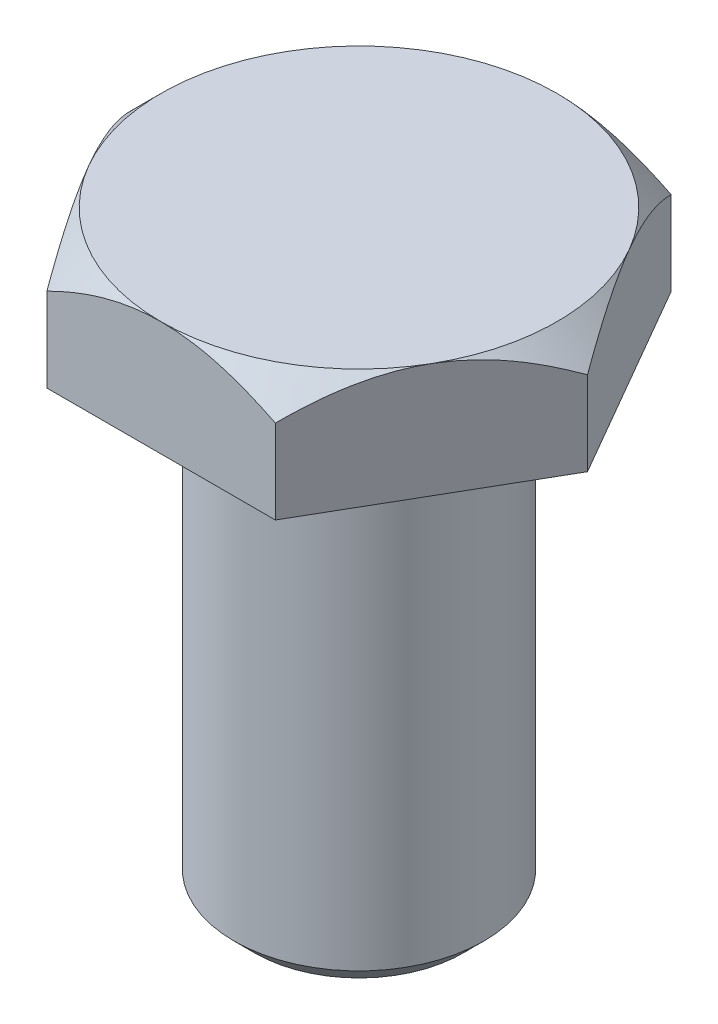
ISO-10303-21;
HEADER;
FILE_DESCRIPTION(('STEP AP214'),'2;1');
FILE_NAME('part.step','',(''),(''),'','','');
FILE_SCHEMA(('AUTOMOTIVE_DESIGN { 1 0 10303 214 1 1 1 1 }'));
ENDSEC;
DATA;
#1=APPLICATION_CONTEXT('core data for automotive mechanical design processes');
#2=APPLICATION_PROTOCOL_DEFINITION('international standard','automotive_design',2000,#1);
#3=PRODUCT_CONTEXT('',#1,'mechanical');
#4=PRODUCT('Part','Part','',(#3));
#5=PRODUCT_RELATED_PRODUCT_CATEGORY('part','',(#4));
#6=PRODUCT_DEFINITION_FORMATION('','',#4);
#7=PRODUCT_DEFINITION_CONTEXT('part definition',#1,'design');
#8=PRODUCT_DEFINITION('design','',#6,#7);
#9=PRODUCT_DEFINITION_SHAPE('','',#8);
#10=(LENGTH_UNIT() NAMED_UNIT(*) SI_UNIT(.MILLI.,.METRE.));
#11=(NAMED_UNIT(*) PLANE_ANGLE_UNIT() SI_UNIT($,.RADIAN.));
#12=(NAMED_UNIT(*) SI_UNIT($,.STERADIAN.) SOLID_ANGLE_UNIT());
#13=UNCERTAINTY_MEASURE_WITH_UNIT(LENGTH_MEASURE(1.E-05),#10,'distance_accuracy_value','');
#14=(GEOMETRIC_REPRESENTATION_CONTEXT(3) GLOBAL_UNCERTAINTY_ASSIGNED_CONTEXT((#13)) GLOBAL_UNIT_ASSIGNED_CONTEXT((#10,
#11,#12)) REPRESENTATION_CONTEXT('',''));
#15=CARTESIAN_POINT('',(0.,0.,0.));
#16=DIRECTION('',(0.,0.,1.));
#17=DIRECTION('',(1.,0.,0.));
#18=AXIS2_PLACEMENT_3D('',#15,#16,#17);
#19=CARTESIAN_POINT('',(5.48482755730145,5.5,9.5));
#20=DIRECTION('',(-0.866025403784439,0.,-0.5));
#21=DIRECTION('',(-0.5,0.,0.866025403784439));
#22=AXIS2_PLACEMENT_3D('',#19,#20,#21);
#23=PLANE('',#22);
#24=CARTESIAN_POINT('',(5.48471208724761,4.03022941352008,9.5002));
#25=CARTESIAN_POINT('',(5.57900903100241,4.12451305275812,9.33687290241823));
#26=CARTESIAN_POINT('',(5.67404447275101,4.21591967907672,9.17226668878989));
#27=CARTESIAN_POINT('',(5.86570730642932,4.39206501429793,8.84029692293643));
#28=CARTESIAN_POINT('',(5.96233553343551,4.47680008162165,8.67293192431642));
#29=CARTESIAN_POINT('',(6.15775465782218,4.63904726595057,8.33445607210808));
#30=CARTESIAN_POINT('',(6.25655477026744,4.71651524790198,8.16332925755938));
#31=CARTESIAN_POINT('',(6.45577775543312,4.86254572212603,7.81826492521687));
#32=CARTESIAN_POINT('',(6.55620037740737,4.93110957593673,7.6443278417282));
#33=CARTESIAN_POINT('',(6.75705373920339,5.05716241426521,7.29643961422646));
#34=CARTESIAN_POINT('',(6.8574597962813,5.11480781409619,7.12253122197986));
#35=CARTESIAN_POINT('',(7.05967942874735,5.21916953089301,6.77227654426076));
#36=CARTESIAN_POINT('',(7.16149285135171,5.26588702447714,6.59593052341753));
#37=CARTESIAN_POINT('',(7.36609172761754,5.3472167639281,6.24155487455362));
#38=CARTESIAN_POINT('',(7.46887444897753,5.38185625756676,6.06352997901792));
#39=CARTESIAN_POINT('',(7.67530278601613,5.43826883773012,5.70598561114512));
#40=CARTESIAN_POINT('',(7.77894827040215,5.46004384690283,5.52646636621343));
#41=CARTESIAN_POINT('',(8.03152319659844,5.49655435673329,5.08899376132351));
#42=CARTESIAN_POINT('',(8.18072563612125,5.50421609749858,4.83056755545678));
#43=CARTESIAN_POINT('',(8.47886067593323,5.49135626172781,4.31418251898585));
#44=CARTESIAN_POINT('',(8.62779316331623,5.47082480615118,4.05622388394088));
#45=CARTESIAN_POINT('',(8.92425422695666,5.40279045892086,3.54273825924976));
#46=CARTESIAN_POINT('',(9.07178104546182,5.35525740747113,3.28721431411982));
#47=CARTESIAN_POINT('',(9.36429897995981,5.2358036134359,2.78055838944421));
#48=CARTESIAN_POINT('',(9.50929028950328,5.1638847409879,2.52942607465897));
#49=CARTESIAN_POINT('',(9.76666961157864,5.01592936852339,2.0836320120068));
#50=CARTESIAN_POINT('',(9.87962765862301,4.94378482539215,1.88798293540221));
#51=CARTESIAN_POINT('',(10.1035161311739,4.78787046820498,1.5001967257151));
#52=CARTESIAN_POINT('',(10.2144464952021,4.70410030232546,1.30805969911616));
#53=CARTESIAN_POINT('',(10.4339302023285,4.52681237218113,0.927902766939698));
#54=CARTESIAN_POINT('',(10.5424897875299,4.43332526303183,0.739872049722142));
#55=CARTESIAN_POINT('',(10.7575988522843,4.23783068526742,0.367292220399022));
#56=CARTESIAN_POINT('',(10.8641495158537,4.13582844079842,0.182741057516513));
#57=CARTESIAN_POINT('',(10.9697705846567,4.03022941352008,-0.000200000000001017));
#58=B_SPLINE_CURVE_WITH_KNOTS('',3,(#24,#25,#26,#27,#28,#29,#30,#31,#32,#33,#34,#35,#36,#37,#38,
#39,#40,#41,#42,#43,#44,#45,#46,#47,#48,#49,#50,#51,#52,#53,#54,#55,#56,#57),.UNSPECIFIED.,.F.,
.F.,(4,2,2,2,2,2,2,2,2,2,2,2,2,2,2,2,4),(0.,0.63257206267041,1.26548704629925,1.9020259640234,
2.53846743312796,3.16495668699838,3.79137845508004,4.41637774062803,5.04128359391858,
5.93539756360894,6.82982491537984,7.72525327976969,8.62061298969156,9.33174689146321,
10.0429023188133,10.7518786251228,11.4604231176808),.UNSPECIFIED.);
#59=CARTESIAN_POINT('',(5.48482755730146,4.03034488539711,9.5));
#60=VERTEX_POINT('',#59);
#61=CARTESIAN_POINT('',(8.22724133595217,5.5,4.75));
#62=VERTEX_POINT('',#61);
#63=EDGE_CURVE('E123',#60,#62,#58,.T.);
#64=ORIENTED_EDGE('',*,*,#63,.F.);
#65=DIRECTION('',(0.,-1.,0.));
#66=VECTOR('',#65,1.);
#67=CARTESIAN_POINT('',(5.48482755730145,5.5,9.5));
#68=LINE('',#67,#66);
#69=CARTESIAN_POINT('',(5.48482755730145,0.,9.5));
#70=VERTEX_POINT('',#69);
#71=EDGE_CURVE('E69',#60,#70,#68,.T.);
#72=ORIENTED_EDGE('',*,*,#71,.T.);
#73=DIRECTION('',(0.5,0.,-0.866025403784439));
#74=VECTOR('',#73,1.);
#75=CARTESIAN_POINT('',(5.48482755730145,0.,9.5));
#76=LINE('',#75,#74);
#77=CARTESIAN_POINT('',(10.9696551146029,0.,0.));
#78=VERTEX_POINT('',#77);
#79=EDGE_CURVE('E133',#70,#78,#76,.T.);
#80=ORIENTED_EDGE('',*,*,#79,.T.);
#81=DIRECTION('',(0.,-1.,0.));
#82=VECTOR('',#81,1.);
#83=CARTESIAN_POINT('',(10.9696551146029,5.5,0.));
#84=LINE('',#83,#82);
#85=CARTESIAN_POINT('',(10.9696551146029,4.03034488539711,0.));
#86=VERTEX_POINT('',#85);
#87=EDGE_CURVE('E152',#86,#78,#84,.T.);
#88=ORIENTED_EDGE('',*,*,#87,.F.);
#89=EDGE_CURVE('E132',#62,#86,#58,.T.);
#90=ORIENTED_EDGE('',*,*,#89,.F.);
#91=EDGE_LOOP('',(#64,#72,#80,#88,#90));
#92=FACE_BOUND('',#91,.T.);
#93=ADVANCED_FACE('F45',(#92),#23,.F.);
#94=CARTESIAN_POINT('',(10.9696551146029,5.5,0.));
#95=DIRECTION('',(-0.866025403784438,0.,0.500000000000001));
#96=DIRECTION('',(0.500000000000001,0.,0.866025403784438));
#97=AXIS2_PLACEMENT_3D('',#94,#95,#96);
#98=PLANE('',#97);
#99=CARTESIAN_POINT('',(10.9697705846567,4.03022941352008,0.000200000000000085));
#100=CARTESIAN_POINT('',(10.8754736409019,4.12451305275812,-0.163127097581767));
#101=CARTESIAN_POINT('',(10.7804381991533,4.21591967907672,-0.327733311210104));
#102=CARTESIAN_POINT('',(10.588775365475,4.39206501429793,-0.659703077063567));
#103=CARTESIAN_POINT('',(10.4921471384688,4.47680008162164,-0.827068075683574));
#104=CARTESIAN_POINT('',(10.2967280140822,4.63904726595057,-1.16554392789191));
#105=CARTESIAN_POINT('',(10.1979279016369,4.71651524790198,-1.33667074244062));
#106=CARTESIAN_POINT('',(9.99870491647122,4.86254572212603,-1.68173507478313));
#107=CARTESIAN_POINT('',(9.89828229449697,4.93110957593673,-1.85567215827181));
#108=CARTESIAN_POINT('',(9.69742893270094,5.05716241426521,-2.20356038577354));
#109=CARTESIAN_POINT('',(9.59702287562303,5.11480781409619,-2.37746877802014));
#110=CARTESIAN_POINT('',(9.39480324315698,5.21916953089301,-2.72772345573924));
#111=CARTESIAN_POINT('',(9.29298982055263,5.26588702447714,-2.90406947658247));
#112=CARTESIAN_POINT('',(9.0883909442868,5.3472167639281,-3.25844512544638));
#113=CARTESIAN_POINT('',(8.98560822292681,5.38185625756677,-3.43647002098208));
#114=CARTESIAN_POINT('',(8.77917988588821,5.43826883773012,-3.79401438885488));
#115=CARTESIAN_POINT('',(8.67553440150218,5.46004384690283,-3.97353363378657));
#116=CARTESIAN_POINT('',(8.4229594753059,5.4965543567333,-4.4110062386765));
#117=CARTESIAN_POINT('',(8.27375703578308,5.50421609749859,-4.66943244454323));
#118=CARTESIAN_POINT('',(7.9756219959711,5.49135626172781,-5.18581748101415));
#119=CARTESIAN_POINT('',(7.8266895085881,5.47082480615119,-5.44377611605912));
#120=CARTESIAN_POINT('',(7.53022844494767,5.40279045892086,-5.95726174075025));
#121=CARTESIAN_POINT('',(7.38270162644251,5.35525740747113,-6.21278568588018));
#122=CARTESIAN_POINT('',(7.09018369194453,5.2358036134359,-6.7194416105558));
#123=CARTESIAN_POINT('',(6.94519238240105,5.1638847409879,-6.97057392534104));
#124=CARTESIAN_POINT('',(6.68781306032569,5.01592936852339,-7.4163679879932));
#125=CARTESIAN_POINT('',(6.57485501328133,4.94378482539215,-7.61201706459779));
#126=CARTESIAN_POINT('',(6.35096654073045,4.78787046820498,-7.99980327428491));
#127=CARTESIAN_POINT('',(6.24003617670226,4.70410030232547,-8.19194030088384));
#128=CARTESIAN_POINT('',(6.02055246957587,4.52681237218114,-8.5720972330603));
#129=CARTESIAN_POINT('',(5.9119928843744,4.43332526303183,-8.76012795027786));
#130=CARTESIAN_POINT('',(5.69688381962007,4.23783068526743,-9.13270777960098));
#131=CARTESIAN_POINT('',(5.5903331560506,4.13582844079842,-9.31725894248349));
#132=CARTESIAN_POINT('',(5.4847120872476,4.03022941352008,-9.5002));
#133=B_SPLINE_CURVE_WITH_KNOTS('',3,(#99,#100,#101,#102,#103,#104,#105,#106,#107,#108,#109,#110,
#111,#112,#113,#114,#115,#116,#117,#118,#119,#120,#121,#122,#123,#124,#125,#126,#127,#128,#129,
#130,#131,#132),.UNSPECIFIED.,.F.,.F.,(4,2,2,2,2,2,2,2,2,2,2,2,2,2,2,2,4),(0.,0.632572062670412,
1.26548704629925,1.90202596402341,2.53846743312797,3.16495668699839,3.79137845508005,
4.41637774062804,5.0412835939186,5.93539756360895,6.82982491537985,7.72525327976971,
8.62061298969157,9.33174689146323,10.0429023188133,10.7518786251229,11.4604231176808),.UNSPECIFIED.);
#134=CARTESIAN_POINT('',(8.22724133595217,5.5,-4.75000000000001));
#135=VERTEX_POINT('',#134);
#136=EDGE_CURVE('E231',#86,#135,#133,.T.);
#137=ORIENTED_EDGE('',*,*,#136,.F.);
#138=ORIENTED_EDGE('',*,*,#87,.T.);
#139=DIRECTION('',(-0.5,0.,-0.866025403784438));
#140=VECTOR('',#139,1.);
#141=CARTESIAN_POINT('',(10.9696551146029,0.,0.));
#142=LINE('',#141,#140);
#143=CARTESIAN_POINT('',(5.48482755730144,0.,-9.5));
#144=VERTEX_POINT('',#143);
#145=EDGE_CURVE('E266',#78,#144,#142,.T.);
#146=ORIENTED_EDGE('',*,*,#145,.T.);
#147=DIRECTION('',(0.,-1.,0.));
#148=VECTOR('',#147,1.);
#149=CARTESIAN_POINT('',(5.48482755730144,5.5,-9.5));
#150=LINE('',#149,#148);
#151=CARTESIAN_POINT('',(5.48482755730145,4.03034488539711,-9.5));
#152=VERTEX_POINT('',#151);
#153=EDGE_CURVE('E150',#152,#144,#150,.T.);
#154=ORIENTED_EDGE('',*,*,#153,.F.);
#155=EDGE_CURVE('E225',#135,#152,#133,.T.);
#156=ORIENTED_EDGE('',*,*,#155,.F.);
#157=EDGE_LOOP('',(#137,#138,#146,#154,#156));
#158=FACE_BOUND('',#157,.T.);
#159=ADVANCED_FACE('F239',(#158),#98,.F.);
#160=CARTESIAN_POINT('',(5.48482755730144,5.5,-9.5));
#161=DIRECTION('',(0.,0.,1.));
#162=DIRECTION('',(1.,0.,0.));
#163=AXIS2_PLACEMENT_3D('',#160,#161,#162);
#164=PLANE('',#163);
#165=CARTESIAN_POINT('',(16.5526930513978,-4.08511585644147,-9.5));
#166=CARTESIAN_POINT('',(16.3078975093556,-3.87281064033944,-9.5));
#167=CARTESIAN_POINT('',(16.0625313530003,-3.66116146645664,-9.5));
#168=CARTESIAN_POINT('',(15.5705039782896,-3.23936595886109,-9.5));
#169=CARTESIAN_POINT('',(15.3238427385609,-3.02921965008696,-9.5));
#170=CARTESIAN_POINT('',(14.8289626137527,-2.61052881441162,-9.5));
#171=CARTESIAN_POINT('',(14.5807430479804,-2.40198509096151,-9.5));
#172=CARTESIAN_POINT('',(14.0826815219023,-1.98684897000587,-9.5));
#173=CARTESIAN_POINT('',(13.8328395672994,-1.78025656564741,-9.5));
#174=CARTESIAN_POINT('',(13.0690339736071,-1.15434157818636,-9.5));
#175=CARTESIAN_POINT('',(12.5521592758855,-0.738542800162536,-9.5));
#176=CARTESIAN_POINT('',(11.7695040497769,-0.124327504116688,-9.5));
#177=CARTESIAN_POINT('',(11.507423703153,0.0788091039046497,-9.5));
#178=CARTESIAN_POINT('',(10.9804259452721,0.481364439199906,-9.5));
#179=CARTESIAN_POINT('',(10.7155085937285,0.680783244485111,-9.5));
#180=CARTESIAN_POINT('',(10.182049087553,1.07549325818297,-9.5));
#181=CARTESIAN_POINT('',(9.91350246392285,1.27077843710951,-9.5));
#182=CARTESIAN_POINT('',(9.37263900317949,1.65607522397668,-9.5));
#183=CARTESIAN_POINT('',(9.10032212381803,1.84608677275087,-9.5));
#184=CARTESIAN_POINT('',(8.5511040508471,2.21990378369879,-9.5));
#185=CARTESIAN_POINT('',(8.27419909438331,2.40370373356655,-9.5));
#186=CARTESIAN_POINT('',(7.71537207132478,2.7635278733879,-9.5));
#187=CARTESIAN_POINT('',(7.43345011396875,2.939552232355,-9.5));
#188=CARTESIAN_POINT('',(6.86601677310837,3.28073476767734,-9.5));
#189=CARTESIAN_POINT('',(6.58054944164094,3.44596586624554,-9.5));
#190=CARTESIAN_POINT('',(6.00311604351526,3.76481218488239,-9.5));
#191=CARTESIAN_POINT('',(5.71114919950853,3.91842600574613,-9.5));
#192=CARTESIAN_POINT('',(5.12043515567325,4.21097227681983,-9.5));
#193=CARTESIAN_POINT('',(4.8216986951507,4.34992623962902,-9.5));
#194=CARTESIAN_POINT('',(4.21657051360468,4.60986676858188,-9.5));
#195=CARTESIAN_POINT('',(3.91018182234153,4.73086031809269,-9.5));
#196=CARTESIAN_POINT('',(3.28232408499689,4.95333057796222,-9.5));
#197=CARTESIAN_POINT('',(2.96067021723213,5.05429302050932,-9.5));
#198=CARTESIAN_POINT('',(2.30981414137871,5.22825264789689,-9.5));
#199=CARTESIAN_POINT('',(1.98061314702205,5.30125429642786,-9.5));
#200=CARTESIAN_POINT('',(1.31859709228853,5.41443128902268,-9.5));
#201=CARTESIAN_POINT('',(0.985816892761966,5.45480651597028,-9.5));
#202=CARTESIAN_POINT('',(0.317839349931747,5.50052179933779,-9.5));
#203=CARTESIAN_POINT('',(-0.0173577358812772,5.50586553431007,-9.5));
#204=CARTESIAN_POINT('',(-0.686846353851571,5.4810888627539,-9.5));
#205=CARTESIAN_POINT('',(-1.02113613756876,5.45092224928178,-9.5));
#206=CARTESIAN_POINT('',(-1.68499248709887,5.3573312936306,-9.5));
#207=CARTESIAN_POINT('',(-2.01455810978228,5.29390040302652,-9.5));
#208=CARTESIAN_POINT('',(-2.66891687175004,5.13737631327669,-9.5));
#209=CARTESIAN_POINT('',(-2.99365954142614,5.04407579579886,-9.5));
#210=CARTESIAN_POINT('',(-3.63491027073979,4.83285441566069,-9.5));
#211=CARTESIAN_POINT('',(-3.95141823945259,4.71493328127758,-9.5));
#212=CARTESIAN_POINT('',(-4.6466341624565,4.43027536615136,-9.5));
#213=CARTESIAN_POINT('',(-5.02327276275549,4.2585270273701,-9.5));
#214=CARTESIAN_POINT('',(-5.7653347821525,3.89212395071921,-9.5));
#215=CARTESIAN_POINT('',(-6.1307515640984,3.69745597391214,-9.5));
#216=CARTESIAN_POINT('',(-6.8524378145585,3.29030367022418,-9.5));
#217=CARTESIAN_POINT('',(-7.20868676254941,3.07778326602305,-9.5));
#218=CARTESIAN_POINT('',(-7.91270456069234,2.63937350012648,-9.5));
#219=CARTESIAN_POINT('',(-8.2604750827682,2.41348680483684,-9.5));
#220=CARTESIAN_POINT('',(-8.95081024134317,1.95004813016442,-9.5));
#221=CARTESIAN_POINT('',(-9.29333730920916,1.71244045281005,-9.5));
#222=CARTESIAN_POINT('',(-9.97246197776837,1.22890063426429,-9.5));
#223=CARTESIAN_POINT('',(-10.3090593500125,0.98296817341175,-9.5));
#224=CARTESIAN_POINT('',(-10.9768951226687,0.48473683286721,-9.5));
#225=CARTESIAN_POINT('',(-11.3081392193624,0.232445567484202,-9.5));
#226=CARTESIAN_POINT('',(-11.9664417550188,-0.277513707377575,-9.5));
#227=CARTESIAN_POINT('',(-12.2935002853568,-0.535181599154791,-9.5));
#228=CARTESIAN_POINT('',(-12.9544953754966,-1.063255797732,-9.5));
#229=CARTESIAN_POINT('',(-13.2883169283815,-1.33380582954674,-9.5));
#230=CARTESIAN_POINT('',(-13.9528282313241,-1.87884220734663,-9.5));
#231=CARTESIAN_POINT('',(-14.2835173997889,-2.15332926142478,-9.5));
#232=CARTESIAN_POINT('',(-14.9386114943959,-2.7025571077114,-9.5));
#233=CARTESIAN_POINT('',(-15.263045701968,-2.97726302318607,-9.5));
#234=CARTESIAN_POINT('',(-15.9095411921518,-3.52931410408089,-9.5));
#235=CARTESIAN_POINT('',(-16.2316029704651,-3.80665868872229,-9.5));
#236=CARTESIAN_POINT('',(-16.5526930513978,-4.08511585644147,-9.5));
#237=B_SPLINE_CURVE_WITH_KNOTS('',3,(#165,#166,#167,#168,#169,#170,#171,#172,#173,#174,#175,
#176,#177,#178,#179,#180,#181,#182,#183,#184,#185,#186,#187,#188,#189,#190,#191,#192,#193,#194,
#195,#196,#197,#198,#199,#200,#201,#202,#203,#204,#205,#206,#207,#208,#209,#210,#211,#212,#213,
#214,#215,#216,#217,#218,#219,#220,#221,#222,#223,#224,#225,#226,#227,#228,#229,#230,#231,#232,
#233,#234,#235,#236),.UNSPECIFIED.,.F.,.F.,(4,2,2,2,2,2,2,2,2,2,2,2,2,2,2,2,2,2,2,2,2,2,2,2,2,2,
2,2,2,2,2,2,2,2,2,4),(0.,0.972104021223937,1.94422413634167,2.91680341227861,3.88937927130256,
5.87928506457271,6.87402393691984,7.86874191294628,8.86482273543619,9.86091472873959,
10.8578686266059,11.8548008435885,12.8440946573635,13.8335074342521,14.8214474889508,
15.8090024009623,16.8193251954059,17.8294866335669,18.8334114623053,19.8372308702065,
20.8423579179451,21.8476829099005,22.8601426855627,23.8726136357182,25.1134086182597,
26.3549238630854,27.5990113514737,28.8428514914161,30.0933131313489,31.3438228420174,
32.592900297553,33.8419504377376,35.1309875899323,36.4202595637108,37.6955823580867,
38.9706306612628),.UNSPECIFIED.);
#238=CARTESIAN_POINT('',(0.,5.5,-9.5));
#239=VERTEX_POINT('',#238);
#240=EDGE_CURVE('E232',#152,#239,#237,.T.);
#241=ORIENTED_EDGE('',*,*,#240,.F.);
#242=ORIENTED_EDGE('',*,*,#153,.T.);
#243=DIRECTION('',(-1.,0.,0.));
#244=VECTOR('',#243,1.);
#245=CARTESIAN_POINT('',(5.48482755730144,0.,-9.5));
#246=LINE('',#245,#244);
#247=CARTESIAN_POINT('',(-5.48482755730144,0.,-9.5));
#248=VERTEX_POINT('',#247);
#249=EDGE_CURVE('E267',#144,#248,#246,.T.);
#250=ORIENTED_EDGE('',*,*,#249,.T.);
#251=DIRECTION('',(0.,-1.,0.));
#252=VECTOR('',#251,1.);
#253=CARTESIAN_POINT('',(-5.48482755730144,5.5,-9.5));
#254=LINE('',#253,#252);
#255=CARTESIAN_POINT('',(-5.48482755730144,4.03034488539711,-9.50000000000001));
#256=VERTEX_POINT('',#255);
#257=EDGE_CURVE('E148',#256,#248,#254,.T.);
#258=ORIENTED_EDGE('',*,*,#257,.F.);
#259=EDGE_CURVE('E218',#239,#256,#237,.T.);
#260=ORIENTED_EDGE('',*,*,#259,.F.);
#261=EDGE_LOOP('',(#241,#242,#250,#258,#260));
#262=FACE_BOUND('',#261,.T.);
#263=ADVANCED_FACE('F242',(#262),#164,.F.);
#264=CARTESIAN_POINT('',(-5.48482755730144,5.5,-9.5));
#265=DIRECTION('',(0.866025403784439,0.,0.5));
#266=DIRECTION('',(0.5,0.,-0.866025403784439));
#267=AXIS2_PLACEMENT_3D('',#264,#265,#266);
#268=PLANE('',#267);
#269=CARTESIAN_POINT('',(-5.48471208724761,4.03022941352008,-9.5002));
#270=CARTESIAN_POINT('',(-5.5790090310024,4.12451305275812,-9.33687290241824));
#271=CARTESIAN_POINT('',(-5.674044472751,4.21591967907672,-9.1722666887899));
#272=CARTESIAN_POINT('',(-5.86570730642932,4.39206501429793,-8.84029692293644));
#273=CARTESIAN_POINT('',(-5.9623355334355,4.47680008162165,-8.67293192431643));
#274=CARTESIAN_POINT('',(-6.15775465782217,4.63904726595057,-8.33445607210809));
#275=CARTESIAN_POINT('',(-6.25655477026743,4.71651524790198,-8.16332925755938));
#276=CARTESIAN_POINT('',(-6.45577775543312,4.86254572212603,-7.81826492521687));
#277=CARTESIAN_POINT('',(-6.55620037740736,4.93110957593673,-7.6443278417282));
#278=CARTESIAN_POINT('',(-6.75705373920339,5.05716241426521,-7.29643961422647));
#279=CARTESIAN_POINT('',(-6.8574597962813,5.11480781409619,-7.12253122197987));
#280=CARTESIAN_POINT('',(-7.05967942874735,5.21916953089301,-6.77227654426077));
#281=CARTESIAN_POINT('',(-7.16149285135171,5.26588702447714,-6.59593052341754));
#282=CARTESIAN_POINT('',(-7.36609172761754,5.3472167639281,-6.24155487455362));
#283=CARTESIAN_POINT('',(-7.46887444897753,5.38185625756677,-6.06352997901792));
#284=CARTESIAN_POINT('',(-7.67530278601612,5.43826883773012,-5.70598561114512));
#285=CARTESIAN_POINT('',(-7.77894827040215,5.46004384690283,-5.52646636621343));
#286=CARTESIAN_POINT('',(-8.03152319659843,5.4965543567333,-5.08899376132351));
#287=CARTESIAN_POINT('',(-8.18072563612125,5.50421609749859,-4.83056755545678));
#288=CARTESIAN_POINT('',(-8.47886067593323,5.49135626172781,-4.31418251898585));
#289=CARTESIAN_POINT('',(-8.62779316331623,5.47082480615119,-4.05622388394089));
#290=CARTESIAN_POINT('',(-8.92425422695665,5.40279045892086,-3.54273825924976));
#291=CARTESIAN_POINT('',(-9.07178104546182,5.35525740747113,-3.28721431411983));
#292=CARTESIAN_POINT('',(-9.3642989799598,5.2358036134359,-2.78055838944421));
#293=CARTESIAN_POINT('',(-9.50929028950327,5.16388474098791,-2.52942607465897));
#294=CARTESIAN_POINT('',(-9.76666961157864,5.01592936852339,-2.08363201200681));
#295=CARTESIAN_POINT('',(-9.879627658623,4.94378482539215,-1.88798293540222));
#296=CARTESIAN_POINT('',(-10.1035161311739,4.78787046820498,-1.5001967257151));
#297=CARTESIAN_POINT('',(-10.2144464952021,4.70410030232547,-1.30805969911617));
#298=CARTESIAN_POINT('',(-10.4339302023285,4.52681237218114,-0.927902766939701));
#299=CARTESIAN_POINT('',(-10.5424897875299,4.43332526303184,-0.739872049722146));
#300=CARTESIAN_POINT('',(-10.7575988522843,4.23783068526743,-0.367292220399026));
#301=CARTESIAN_POINT('',(-10.8641495158537,4.13582844079842,-0.182741057516517));
#302=CARTESIAN_POINT('',(-10.9697705846567,4.03022941352008,0.000199999999996115));
#303=B_SPLINE_CURVE_WITH_KNOTS('',3,(#269,#270,#271,#272,#273,#274,#275,#276,#277,#278,#279,
#280,#281,#282,#283,#284,#285,#286,#287,#288,#289,#290,#291,#292,#293,#294,#295,#296,#297,#298,
#299,#300,#301,#302),.UNSPECIFIED.,.F.,.F.,(4,2,2,2,2,2,2,2,2,2,2,2,2,2,2,2,4),(0.,
0.632572062670412,1.26548704629925,1.90202596402341,2.53846743312796,3.16495668699838,
3.79137845508004,4.41637774062803,5.04128359391859,5.93539756360894,6.82982491537984,
7.72525327976969,8.62061298969156,9.33174689146322,10.0429023188133,10.7518786251228,
11.4604231176808),.UNSPECIFIED.);
#304=CARTESIAN_POINT('',(-8.22724133595217,5.5,-4.75));
#305=VERTEX_POINT('',#304);
#306=EDGE_CURVE('E279',#256,#305,#303,.T.);
#307=ORIENTED_EDGE('',*,*,#306,.F.);
#308=ORIENTED_EDGE('',*,*,#257,.T.);
#309=DIRECTION('',(-0.5,0.,0.866025403784439));
#310=VECTOR('',#309,1.);
#311=CARTESIAN_POINT('',(-5.48482755730144,0.,-9.5));
#312=LINE('',#311,#310);
#313=CARTESIAN_POINT('',(-10.9696551146029,0.,0.));
#314=VERTEX_POINT('',#313);
#315=EDGE_CURVE('E272',#248,#314,#312,.T.);
#316=ORIENTED_EDGE('',*,*,#315,.T.);
#317=DIRECTION('',(0.,-1.,0.));
#318=VECTOR('',#317,1.);
#319=CARTESIAN_POINT('',(-10.9696551146029,5.5,0.));
#320=LINE('',#319,#318);
#321=CARTESIAN_POINT('',(-10.9696551146029,4.03034488539711,0.));
#322=VERTEX_POINT('',#321);
#323=EDGE_CURVE('E141',#322,#314,#320,.T.);
#324=ORIENTED_EDGE('',*,*,#323,.F.);
#325=EDGE_CURVE('E186',#305,#322,#303,.T.);
#326=ORIENTED_EDGE('',*,*,#325,.F.);
#327=EDGE_LOOP('',(#307,#308,#316,#324,#326));
#328=FACE_BOUND('',#327,.T.);
#329=ADVANCED_FACE('F277',(#328),#268,.F.);
#330=CARTESIAN_POINT('',(-10.9696551146029,5.5,0.));
#331=DIRECTION('',(0.866025403784439,0.,-0.5));
#332=DIRECTION('',(-0.5,0.,-0.866025403784439));
#333=AXIS2_PLACEMENT_3D('',#330,#331,#332);
#334=PLANE('',#333);
#335=CARTESIAN_POINT('',(-10.9697705846567,4.03022941352008,-0.000200000000003556));
#336=CARTESIAN_POINT('',(-10.8754736409019,4.12451305275812,0.163127097581764));
#337=CARTESIAN_POINT('',(-10.7804381991533,4.21591967907672,0.3277333112101));
#338=CARTESIAN_POINT('',(-10.588775365475,4.39206501429793,0.659703077063562));
#339=CARTESIAN_POINT('',(-10.4921471384688,4.47680008162165,0.82706807568357));
#340=CARTESIAN_POINT('',(-10.2967280140822,4.63904726595057,1.16554392789191));
#341=CARTESIAN_POINT('',(-10.1979279016369,4.71651524790199,1.33667074244062));
#342=CARTESIAN_POINT('',(-9.99870491647121,4.86254572212603,1.68173507478313));
#343=CARTESIAN_POINT('',(-9.89828229449697,4.93110957593673,1.8556721582718));
#344=CARTESIAN_POINT('',(-9.69742893270094,5.05716241426521,2.20356038577353));
#345=CARTESIAN_POINT('',(-9.59702287562303,5.11480781409619,2.37746877802013));
#346=CARTESIAN_POINT('',(-9.39480324315698,5.21916953089301,2.72772345573923));
#347=CARTESIAN_POINT('',(-9.29298982055262,5.26588702447715,2.90406947658246));
#348=CARTESIAN_POINT('',(-9.08839094428679,5.3472167639281,3.25844512544638));
#349=CARTESIAN_POINT('',(-8.9856082229268,5.38185625756677,3.43647002098208));
#350=CARTESIAN_POINT('',(-8.77917988588821,5.43826883773013,3.79401438885488));
#351=CARTESIAN_POINT('',(-8.67553440150218,5.46004384690283,3.97353363378657));
#352=CARTESIAN_POINT('',(-8.4229594753059,5.4965543567333,4.41100623867649));
#353=CARTESIAN_POINT('',(-8.27375703578308,5.50421609749859,4.66943244454322));
#354=CARTESIAN_POINT('',(-7.9756219959711,5.49135626172781,5.18581748101415));
#355=CARTESIAN_POINT('',(-7.8266895085881,5.47082480615119,5.44377611605912));
#356=CARTESIAN_POINT('',(-7.53022844494767,5.40279045892087,5.95726174075024));
#357=CARTESIAN_POINT('',(-7.38270162644251,5.35525740747114,6.21278568588018));
#358=CARTESIAN_POINT('',(-7.09018369194453,5.2358036134359,6.71944161055579));
#359=CARTESIAN_POINT('',(-6.94519238240105,5.16388474098791,6.97057392534103));
#360=CARTESIAN_POINT('',(-6.68781306032569,5.01592936852339,7.4163679879932));
#361=CARTESIAN_POINT('',(-6.57485501328133,4.94378482539216,7.61201706459778));
#362=CARTESIAN_POINT('',(-6.35096654073045,4.78787046820498,7.9998032742849));
#363=CARTESIAN_POINT('',(-6.24003617670226,4.70410030232547,8.19194030088383));
#364=CARTESIAN_POINT('',(-6.02055246957587,4.52681237218114,8.5720972330603));
#365=CARTESIAN_POINT('',(-5.9119928843744,4.43332526303184,8.76012795027785));
#366=CARTESIAN_POINT('',(-5.69688381962007,4.23783068526743,9.13270777960097));
#367=CARTESIAN_POINT('',(-5.5903331560506,4.13582844079843,9.31725894248348));
#368=CARTESIAN_POINT('',(-5.4847120872476,4.03022941352009,9.5002));
#369=B_SPLINE_CURVE_WITH_KNOTS('',3,(#335,#336,#337,#338,#339,#340,#341,#342,#343,#344,#345,
#346,#347,#348,#349,#350,#351,#352,#353,#354,#355,#356,#357,#358,#359,#360,#361,#362,#363,#364,
#365,#366,#367,#368),.UNSPECIFIED.,.F.,.F.,(4,2,2,2,2,2,2,2,2,2,2,2,2,2,2,2,4),(0.,
0.632572062670411,1.26548704629925,1.90202596402341,2.53846743312796,3.16495668699838,
3.79137845508004,4.41637774062803,5.04128359391859,5.93539756360895,6.82982491537985,
7.7252532797697,8.62061298969156,9.33174689146322,10.0429023188133,10.7518786251229,
11.4604231176808),.UNSPECIFIED.);
#370=CARTESIAN_POINT('',(-8.22724133595217,5.5,4.75));
#371=VERTEX_POINT('',#370);
#372=EDGE_CURVE('E181',#322,#371,#369,.T.);
#373=ORIENTED_EDGE('',*,*,#372,.F.);
#374=ORIENTED_EDGE('',*,*,#323,.T.);
#375=DIRECTION('',(0.5,0.,0.866025403784438));
#376=VECTOR('',#375,1.);
#377=CARTESIAN_POINT('',(-10.9696551146029,0.,0.));
#378=LINE('',#377,#376);
#379=CARTESIAN_POINT('',(-5.48482755730144,0.,9.5));
#380=VERTEX_POINT('',#379);
#381=EDGE_CURVE('E143',#314,#380,#378,.T.);
#382=ORIENTED_EDGE('',*,*,#381,.T.);
#383=DIRECTION('',(0.,-1.,0.));
#384=VECTOR('',#383,1.);
#385=CARTESIAN_POINT('',(-5.48482755730144,5.5,9.5));
#386=LINE('',#385,#384);
#387=CARTESIAN_POINT('',(-5.48482755730146,4.03034488539711,9.5));
#388=VERTEX_POINT('',#387);
#389=EDGE_CURVE('E139',#388,#380,#386,.T.);
#390=ORIENTED_EDGE('',*,*,#389,.F.);
#391=EDGE_CURVE('E179',#371,#388,#369,.T.);
#392=ORIENTED_EDGE('',*,*,#391,.F.);
#393=EDGE_LOOP('',(#373,#374,#382,#390,#392));
#394=FACE_BOUND('',#393,.T.);
#395=ADVANCED_FACE('F180',(#394),#334,.F.);
#396=CARTESIAN_POINT('',(-5.48482755730144,5.5,9.5));
#397=DIRECTION('',(0.,0.,-1.));
#398=DIRECTION('',(-1.,0.,0.));
#399=AXIS2_PLACEMENT_3D('',#396,#397,#398);
#400=PLANE('',#399);
#401=CARTESIAN_POINT('',(-16.5526930513978,-4.08511585644147,9.5));
#402=CARTESIAN_POINT('',(-16.3078975093556,-3.87281064033944,9.5));
#403=CARTESIAN_POINT('',(-16.0625313530003,-3.66116146645664,9.5));
#404=CARTESIAN_POINT('',(-15.5705039782896,-3.23936595886109,9.5));
#405=CARTESIAN_POINT('',(-15.3238427385609,-3.02921965008696,9.5));
#406=CARTESIAN_POINT('',(-14.8289626137527,-2.61052881441162,9.5));
#407=CARTESIAN_POINT('',(-14.5807430479804,-2.40198509096151,9.5));
#408=CARTESIAN_POINT('',(-14.0826815219023,-1.98684897000587,9.5));
#409=CARTESIAN_POINT('',(-13.8328395672994,-1.78025656564741,9.5));
#410=CARTESIAN_POINT('',(-13.0690339736071,-1.15434157818636,9.5));
#411=CARTESIAN_POINT('',(-12.5521592758855,-0.738542800162536,9.5));
#412=CARTESIAN_POINT('',(-11.7695040497769,-0.124327504116687,9.5));
#413=CARTESIAN_POINT('',(-11.507423703153,0.0788091039046507,9.5));
#414=CARTESIAN_POINT('',(-10.9804259452721,0.481364439199906,9.5));
#415=CARTESIAN_POINT('',(-10.7155085937285,0.68078324448511,9.5));
#416=CARTESIAN_POINT('',(-10.182049087553,1.07549325818296,9.5));
#417=CARTESIAN_POINT('',(-9.91350246392286,1.27077843710951,9.5));
#418=CARTESIAN_POINT('',(-9.3726390031795,1.65607522397668,9.5));
#419=CARTESIAN_POINT('',(-9.10032212381804,1.84608677275087,9.5));
#420=CARTESIAN_POINT('',(-8.55110405084711,2.21990378369879,9.5));
#421=CARTESIAN_POINT('',(-8.27419909438331,2.40370373356655,9.5));
#422=CARTESIAN_POINT('',(-7.71537207132479,2.7635278733879,9.5));
#423=CARTESIAN_POINT('',(-7.43345011396876,2.939552232355,9.5));
#424=CARTESIAN_POINT('',(-6.86601677310838,3.28073476767734,9.5));
#425=CARTESIAN_POINT('',(-6.58054944164094,3.44596586624554,9.5));
#426=CARTESIAN_POINT('',(-6.00311604351527,3.76481218488239,9.5));
#427=CARTESIAN_POINT('',(-5.71114919950854,3.91842600574613,9.5));
#428=CARTESIAN_POINT('',(-5.12043515567326,4.21097227681983,9.5));
#429=CARTESIAN_POINT('',(-4.82169869515071,4.34992623962902,9.5));
#430=CARTESIAN_POINT('',(-4.21657051360469,4.60986676858188,9.5));
#431=CARTESIAN_POINT('',(-3.91018182234154,4.73086031809269,9.5));
#432=CARTESIAN_POINT('',(-3.2823240849969,4.95333057796222,9.5));
#433=CARTESIAN_POINT('',(-2.96067021723214,5.05429302050932,9.5));
#434=CARTESIAN_POINT('',(-2.30981414137872,5.2282526478969,9.5));
#435=CARTESIAN_POINT('',(-1.98061314702206,5.30125429642786,9.5));
#436=CARTESIAN_POINT('',(-1.31859709228854,5.41443128902269,9.5));
#437=CARTESIAN_POINT('',(-0.985816892761975,5.45480651597028,9.5));
#438=CARTESIAN_POINT('',(-0.317839349931756,5.5005217993378,9.5));
#439=CARTESIAN_POINT('',(0.0173577358812691,5.50586553431008,9.5));
#440=CARTESIAN_POINT('',(0.686846353851564,5.4810888627539,9.5));
#441=CARTESIAN_POINT('',(1.02113613756876,5.45092224928178,9.5));
#442=CARTESIAN_POINT('',(1.68499248709886,5.3573312936306,9.5));
#443=CARTESIAN_POINT('',(2.01455810978228,5.29390040302653,9.5));
#444=CARTESIAN_POINT('',(2.66891687175003,5.13737631327669,9.5));
#445=CARTESIAN_POINT('',(2.99365954142614,5.04407579579887,9.5));
#446=CARTESIAN_POINT('',(3.63491027073979,4.83285441566069,9.5));
#447=CARTESIAN_POINT('',(3.95141823945259,4.71493328127758,9.5));
#448=CARTESIAN_POINT('',(4.6466341624565,4.43027536615137,9.5));
#449=CARTESIAN_POINT('',(5.02327276275549,4.25852702737011,9.5));
#450=CARTESIAN_POINT('',(5.76533478215249,3.89212395071922,9.5));
#451=CARTESIAN_POINT('',(6.13075156409839,3.69745597391215,9.5));
#452=CARTESIAN_POINT('',(6.8524378145585,3.29030367022419,9.5));
#453=CARTESIAN_POINT('',(7.20868676254941,3.07778326602306,9.5));
#454=CARTESIAN_POINT('',(7.91270456069233,2.63937350012649,9.5));
#455=CARTESIAN_POINT('',(8.2604750827682,2.41348680483685,9.5));
#456=CARTESIAN_POINT('',(8.95081024134316,1.95004813016443,9.5));
#457=CARTESIAN_POINT('',(9.29333730920915,1.71244045281006,9.5));
#458=CARTESIAN_POINT('',(9.97246197776836,1.2289006342643,9.5));
#459=CARTESIAN_POINT('',(10.3090593500125,0.982968173411762,9.5));
#460=CARTESIAN_POINT('',(10.9768951226687,0.484736832867221,9.5));
#461=CARTESIAN_POINT('',(11.3081392193624,0.232445567484212,9.5));
#462=CARTESIAN_POINT('',(11.9664417550188,-0.277513707377565,9.5));
#463=CARTESIAN_POINT('',(12.2935002853568,-0.535181599154779,9.5));
#464=CARTESIAN_POINT('',(12.9544953754966,-1.06325579773199,9.5));
#465=CARTESIAN_POINT('',(13.2883169283815,-1.33380582954673,9.5));
#466=CARTESIAN_POINT('',(13.9528282313241,-1.87884220734662,9.5));
#467=CARTESIAN_POINT('',(14.2835173997889,-2.15332926142478,9.5));
#468=CARTESIAN_POINT('',(14.9386114943959,-2.7025571077114,9.5));
#469=CARTESIAN_POINT('',(15.263045701968,-2.97726302318607,9.5));
#470=CARTESIAN_POINT('',(15.9095411921518,-3.52931410408089,9.5));
#471=CARTESIAN_POINT('',(16.2316029704651,-3.80665868872229,9.5));
#472=CARTESIAN_POINT('',(16.5526930513978,-4.08511585644148,9.5));
#473=B_SPLINE_CURVE_WITH_KNOTS('',3,(#401,#402,#403,#404,#405,#406,#407,#408,#409,#410,#411,
#412,#413,#414,#415,#416,#417,#418,#419,#420,#421,#422,#423,#424,#425,#426,#427,#428,#429,#430,
#431,#432,#433,#434,#435,#436,#437,#438,#439,#440,#441,#442,#443,#444,#445,#446,#447,#448,#449,
#450,#451,#452,#453,#454,#455,#456,#457,#458,#459,#460,#461,#462,#463,#464,#465,#466,#467,#468,
#469,#470,#471,#472),.UNSPECIFIED.,.F.,.F.,(4,2,2,2,2,2,2,2,2,2,2,2,2,2,2,2,2,2,2,2,2,2,2,2,2,2,
2,2,2,2,2,2,2,2,2,4),(0.,0.972104021223938,1.94422413634167,2.91680341227861,3.88937927130256,
5.87928506457271,6.87402393691985,7.86874191294628,8.86482273543619,9.86091472873959,
10.8578686266059,11.8548008435885,12.8440946573635,13.833507434252,14.8214474889508,
15.8090024009623,16.8193251954059,17.8294866335669,18.8334114623053,19.8372308702065,
20.8423579179451,21.8476829099005,22.8601426855627,23.8726136357182,25.1134086182597,
26.3549238630854,27.5990113514736,28.842851491416,30.0933131313489,31.3438228420173,
32.592900297553,33.8419504377376,35.1309875899323,36.4202595637108,37.6955823580867,
38.9706306612628),.UNSPECIFIED.);
#474=CARTESIAN_POINT('',(0.,5.5,9.5));
#475=VERTEX_POINT('',#474);
#476=EDGE_CURVE('E128',#388,#475,#473,.T.);
#477=ORIENTED_EDGE('',*,*,#476,.F.);
#478=ORIENTED_EDGE('',*,*,#389,.T.);
#479=DIRECTION('',(1.,0.,0.));
#480=VECTOR('',#479,1.);
#481=CARTESIAN_POINT('',(-5.48482755730144,0.,9.5));
#482=LINE('',#481,#480);
#483=EDGE_CURVE('E137',#380,#70,#482,.T.);
#484=ORIENTED_EDGE('',*,*,#483,.T.);
#485=ORIENTED_EDGE('',*,*,#71,.F.);
#486=EDGE_CURVE('E121',#475,#60,#473,.T.);
#487=ORIENTED_EDGE('',*,*,#486,.F.);
#488=EDGE_LOOP('',(#477,#478,#484,#485,#487));
#489=FACE_BOUND('',#488,.T.);
#490=ADVANCED_FACE('F135',(#489),#400,.F.);
#491=CARTESIAN_POINT('',(0.,-23.,0.));
#492=DIRECTION('',(0.,1.,0.));
#493=DIRECTION('',(0.,0.,1.));
#494=AXIS2_PLACEMENT_3D('',#491,#492,#493);
#495=CYLINDRICAL_SURFACE('',#494,6.);
#496=CARTESIAN_POINT('',(0.,-22.,0.));
#497=DIRECTION('',(0.,1.,0.));
#498=DIRECTION('',(0.,0.,1.));
#499=AXIS2_PLACEMENT_3D('',#496,#497,#498);
#500=CIRCLE('',#499,6.);
#501=CARTESIAN_POINT('',(0.,-22.,6.));
#502=VERTEX_POINT('',#501);
#503=EDGE_CURVE('E54',#502,#502,#500,.T.);
#504=ORIENTED_EDGE('',*,*,#503,.T.);
#505=EDGE_LOOP('',(#504));
#506=FACE_BOUND('',#505,.T.);
#507=CARTESIAN_POINT('',(0.,0.,0.));
#508=DIRECTION('',(0.,1.,0.));
#509=DIRECTION('',(0.,0.,1.));
#510=AXIS2_PLACEMENT_3D('',#507,#508,#509);
#511=CIRCLE('',#510,6.);
#512=CARTESIAN_POINT('',(0.,0.,6.));
#513=VERTEX_POINT('',#512);
#514=EDGE_CURVE('E154',#513,#513,#511,.T.);
#515=ORIENTED_EDGE('',*,*,#514,.F.);
#516=EDGE_LOOP('',(#515));
#517=FACE_BOUND('',#516,.T.);
#518=ADVANCED_FACE('F251',(#506,#517),#495,.T.);
#519=CARTESIAN_POINT('',(0.,-23.,0.));
#520=DIRECTION('',(0.,1.,0.));
#521=DIRECTION('',(0.,0.,1.));
#522=AXIS2_PLACEMENT_3D('',#519,#520,#521);
#523=PLANE('',#522);
#524=CARTESIAN_POINT('',(0.,-23.,0.));
#525=DIRECTION('',(0.,1.,0.));
#526=DIRECTION('',(0.,0.,1.));
#527=AXIS2_PLACEMENT_3D('',#524,#525,#526);
#528=CIRCLE('',#527,4.99999999999999);
#529=CARTESIAN_POINT('',(0.,-23.,4.99999999999999));
#530=VERTEX_POINT('',#529);
#531=EDGE_CURVE('E11',#530,#530,#528,.F.);
#532=ORIENTED_EDGE('',*,*,#531,.T.);
#533=EDGE_LOOP('',(#532));
#534=FACE_BOUND('',#533,.T.);
#535=ADVANCED_FACE('F248',(#534),#523,.F.);
#536=CARTESIAN_POINT('',(0.,0.,0.));
#537=DIRECTION('',(0.,1.,0.));
#538=DIRECTION('',(0.,0.,1.));
#539=AXIS2_PLACEMENT_3D('',#536,#537,#538);
#540=PLANE('',#539);
#541=ORIENTED_EDGE('',*,*,#514,.T.);
#542=EDGE_LOOP('',(#541));
#543=FACE_BOUND('',#542,.T.);
#544=ORIENTED_EDGE('',*,*,#79,.F.);
#545=ORIENTED_EDGE('',*,*,#483,.F.);
#546=ORIENTED_EDGE('',*,*,#381,.F.);
#547=ORIENTED_EDGE('',*,*,#315,.F.);
#548=ORIENTED_EDGE('',*,*,#249,.F.);
#549=ORIENTED_EDGE('',*,*,#145,.F.);
#550=EDGE_LOOP('',(#544,#545,#546,#547,#548,#549));
#551=FACE_BOUND('',#550,.T.);
#552=ADVANCED_FACE('F250',(#543,#551),#540,.F.);
#553=CARTESIAN_POINT('',(0.,5.5,0.));
#554=DIRECTION('',(0.,-1.,0.));
#555=DIRECTION('',(0.,0.,-1.));
#556=AXIS2_PLACEMENT_3D('',#553,#554,#555);
#557=CONICAL_SURFACE('',#556,9.5,0.785398163397448);
#558=ORIENTED_EDGE('',*,*,#391,.T.);
#559=ORIENTED_EDGE('',*,*,#476,.T.);
#560=CARTESIAN_POINT('',(0.,5.5,0.));
#561=DIRECTION('',(0.,1.,0.));
#562=DIRECTION('',(0.,0.,1.));
#563=AXIS2_PLACEMENT_3D('',#560,#561,#562);
#564=CIRCLE('',#563,9.5);
#565=EDGE_CURVE('E61',#371,#475,#564,.T.);
#566=ORIENTED_EDGE('',*,*,#565,.F.);
#567=EDGE_LOOP('',(#558,#559,#566));
#568=FACE_BOUND('',#567,.T.);
#569=ADVANCED_FACE('F211',(#568),#557,.T.);
#570=ORIENTED_EDGE('',*,*,#325,.T.);
#571=ORIENTED_EDGE('',*,*,#372,.T.);
#572=EDGE_CURVE('E157',#305,#371,#564,.T.);
#573=ORIENTED_EDGE('',*,*,#572,.F.);
#574=EDGE_LOOP('',(#570,#571,#573));
#575=FACE_BOUND('',#574,.T.);
#576=ADVANCED_FACE('F295',(#575),#557,.T.);
#577=ORIENTED_EDGE('',*,*,#259,.T.);
#578=ORIENTED_EDGE('',*,*,#306,.T.);
#579=EDGE_CURVE('E166',#239,#305,#564,.T.);
#580=ORIENTED_EDGE('',*,*,#579,.F.);
#581=EDGE_LOOP('',(#577,#578,#580));
#582=FACE_BOUND('',#581,.T.);
#583=ADVANCED_FACE('F290',(#582),#557,.T.);
#584=ORIENTED_EDGE('',*,*,#155,.T.);
#585=ORIENTED_EDGE('',*,*,#240,.T.);
#586=EDGE_CURVE('E163',#135,#239,#564,.T.);
#587=ORIENTED_EDGE('',*,*,#586,.F.);
#588=EDGE_LOOP('',(#584,#585,#587));
#589=FACE_BOUND('',#588,.T.);
#590=ADVANCED_FACE('F286',(#589),#557,.T.);
#591=ORIENTED_EDGE('',*,*,#89,.T.);
#592=ORIENTED_EDGE('',*,*,#136,.T.);
#593=EDGE_CURVE('E158',#62,#135,#564,.T.);
#594=ORIENTED_EDGE('',*,*,#593,.F.);
#595=EDGE_LOOP('',(#591,#592,#594));
#596=FACE_BOUND('',#595,.T.);
#597=ADVANCED_FACE('F210',(#596),#557,.T.);
#598=ORIENTED_EDGE('',*,*,#63,.T.);
#599=CARTESIAN_POINT('',(0.,5.5,0.));
#600=DIRECTION('',(0.,1.,0.));
#601=DIRECTION('',(0.,0.,1.));
#602=AXIS2_PLACEMENT_3D('',#599,#600,#601);
#603=CIRCLE('',#602,9.5);
#604=EDGE_CURVE('E125',#475,#62,#603,.T.);
#605=ORIENTED_EDGE('',*,*,#604,.F.);
#606=ORIENTED_EDGE('',*,*,#486,.T.);
#607=EDGE_LOOP('',(#598,#605,#606));
#608=FACE_BOUND('',#607,.T.);
#609=ADVANCED_FACE('F122',(#608),#557,.T.);
#610=CARTESIAN_POINT('',(0.,5.5,0.));
#611=DIRECTION('',(0.,1.,0.));
#612=DIRECTION('',(0.,0.,1.));
#613=AXIS2_PLACEMENT_3D('',#610,#611,#612);
#614=PLANE('',#613);
#615=ORIENTED_EDGE('',*,*,#565,.T.);
#616=ORIENTED_EDGE('',*,*,#604,.T.);
#617=ORIENTED_EDGE('',*,*,#593,.T.);
#618=ORIENTED_EDGE('',*,*,#586,.T.);
#619=ORIENTED_EDGE('',*,*,#579,.T.);
#620=ORIENTED_EDGE('',*,*,#572,.T.);
#621=EDGE_LOOP('',(#615,#616,#617,#618,#619,#620));
#622=FACE_BOUND('',#621,.T.);
#623=ADVANCED_FACE('F174',(#622),#614,.T.);
#624=CARTESIAN_POINT('',(0.,-22.,0.));
#625=DIRECTION('',(0.,1.,0.));
#626=DIRECTION('',(0.,0.,1.));
#627=AXIS2_PLACEMENT_3D('',#624,#625,#626);
#628=CONICAL_SURFACE('',#627,6.,0.785398163397451);
#629=ORIENTED_EDGE('',*,*,#531,.F.);
#630=EDGE_LOOP('',(#629));
#631=FACE_BOUND('',#630,.T.);
#632=ORIENTED_EDGE('',*,*,#503,.F.);
#633=EDGE_LOOP('',(#632));
#634=FACE_BOUND('',#633,.T.);
#635=ADVANCED_FACE('F48',(#631,#634),#628,.T.);
#636=CLOSED_SHELL('',(#93,#159,#263,#329,#395,#490,#518,#535,#552,#569,#576,#583,#590,#597,#609,
#623,#635));
#637=MANIFOLD_SOLID_BREP('B2',#636);
#638=ADVANCED_BREP_SHAPE_REPRESENTATION('',(#18,#637),#14);
#639=SHAPE_DEFINITION_REPRESENTATION(#9,#638);
ENDSEC;
END-ISO-10303-21;
